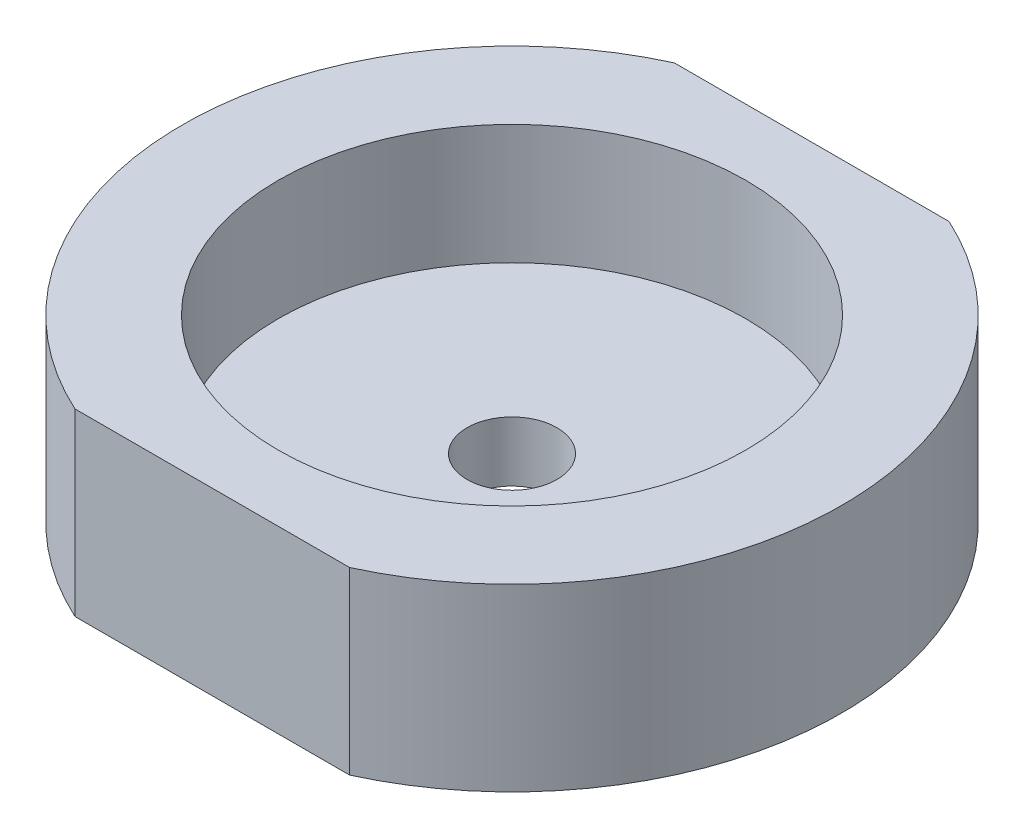
ISO-10303-21;
HEADER;
FILE_DESCRIPTION(('STEP AP214'),'2;1');
FILE_NAME('part.step','',(''),(''),'','','');
FILE_SCHEMA(('AUTOMOTIVE_DESIGN { 1 0 10303 214 1 1 1 1 }'));
ENDSEC;
DATA;
#1=APPLICATION_CONTEXT('core data for automotive mechanical design processes');
#2=APPLICATION_PROTOCOL_DEFINITION('international standard','automotive_design',2000,#1);
#3=PRODUCT_CONTEXT('',#1,'mechanical');
#4=PRODUCT('Part','Part','',(#3));
#5=PRODUCT_RELATED_PRODUCT_CATEGORY('part','',(#4));
#6=PRODUCT_DEFINITION_FORMATION('','',#4);
#7=PRODUCT_DEFINITION_CONTEXT('part definition',#1,'design');
#8=PRODUCT_DEFINITION('design','',#6,#7);
#9=PRODUCT_DEFINITION_SHAPE('','',#8);
#10=(LENGTH_UNIT() NAMED_UNIT(*) SI_UNIT(.MILLI.,.METRE.));
#11=(NAMED_UNIT(*) PLANE_ANGLE_UNIT() SI_UNIT($,.RADIAN.));
#12=(NAMED_UNIT(*) SI_UNIT($,.STERADIAN.) SOLID_ANGLE_UNIT());
#13=UNCERTAINTY_MEASURE_WITH_UNIT(LENGTH_MEASURE(1.E-05),#10,'distance_accuracy_value','');
#14=(GEOMETRIC_REPRESENTATION_CONTEXT(3) GLOBAL_UNCERTAINTY_ASSIGNED_CONTEXT((#13)) GLOBAL_UNIT_ASSIGNED_CONTEXT((#10,
#11,#12)) REPRESENTATION_CONTEXT('',''));
#15=CARTESIAN_POINT('',(0.,0.,0.));
#16=DIRECTION('',(0.,0.,1.));
#17=DIRECTION('',(1.,0.,0.));
#18=AXIS2_PLACEMENT_3D('',#15,#16,#17);
#19=CARTESIAN_POINT('',(0.,3.,-5.));
#20=DIRECTION('',(0.,0.,-1.));
#21=DIRECTION('',(-1.,0.,0.));
#22=AXIS2_PLACEMENT_3D('',#19,#20,#21);
#23=PLANE('',#22);
#24=DIRECTION('',(1.,0.,0.));
#25=VECTOR('',#24,1.);
#26=CARTESIAN_POINT('',(0.,0.,-5.));
#27=LINE('',#26,#25);
#28=CARTESIAN_POINT('',(-2.29128784747792,0.,-5.));
#29=VERTEX_POINT('',#28);
#30=CARTESIAN_POINT('',(2.29128784747792,0.,-5.));
#31=VERTEX_POINT('',#30);
#32=EDGE_CURVE('E106',#29,#31,#27,.T.);
#33=ORIENTED_EDGE('',*,*,#32,.F.);
#34=DIRECTION('',(0.,-1.,0.));
#35=VECTOR('',#34,1.);
#36=CARTESIAN_POINT('',(-2.29128784747792,3.,-5.));
#37=LINE('',#36,#35);
#38=CARTESIAN_POINT('',(-2.29128784747792,3.,-5.));
#39=VERTEX_POINT('',#38);
#40=EDGE_CURVE('E11',#39,#29,#37,.T.);
#41=ORIENTED_EDGE('',*,*,#40,.F.);
#42=DIRECTION('',(1.,0.,0.));
#43=VECTOR('',#42,1.);
#44=CARTESIAN_POINT('',(0.,3.,-5.));
#45=LINE('',#44,#43);
#46=CARTESIAN_POINT('',(2.29128784747792,3.,-5.));
#47=VERTEX_POINT('',#46);
#48=EDGE_CURVE('E90',#39,#47,#45,.T.);
#49=ORIENTED_EDGE('',*,*,#48,.T.);
#50=DIRECTION('',(0.,-1.,0.));
#51=VECTOR('',#50,1.);
#52=CARTESIAN_POINT('',(2.29128784747792,3.,-5.));
#53=LINE('',#52,#51);
#54=EDGE_CURVE('E79',#47,#31,#53,.T.);
#55=ORIENTED_EDGE('',*,*,#54,.T.);
#56=EDGE_LOOP('',(#33,#41,#49,#55));
#57=FACE_BOUND('',#56,.T.);
#58=ADVANCED_FACE('F39',(#57),#23,.T.);
#59=CARTESIAN_POINT('',(0.,3.,0.));
#60=DIRECTION('',(0.,-1.,0.));
#61=DIRECTION('',(0.,0.,-1.));
#62=AXIS2_PLACEMENT_3D('',#59,#60,#61);
#63=CYLINDRICAL_SURFACE('',#62,5.5);
#64=CARTESIAN_POINT('',(0.,0.,0.));
#65=DIRECTION('',(0.,1.,0.));
#66=DIRECTION('',(0.,0.,1.));
#67=AXIS2_PLACEMENT_3D('',#64,#65,#66);
#68=CIRCLE('',#67,5.5);
#69=CARTESIAN_POINT('',(-2.29128784747792,0.,5.));
#70=VERTEX_POINT('',#69);
#71=EDGE_CURVE('E96',#29,#70,#68,.T.);
#72=ORIENTED_EDGE('',*,*,#71,.T.);
#73=DIRECTION('',(0.,-1.,0.));
#74=VECTOR('',#73,1.);
#75=CARTESIAN_POINT('',(-2.29128784747792,3.,5.));
#76=LINE('',#75,#74);
#77=CARTESIAN_POINT('',(-2.29128784747792,3.,5.));
#78=VERTEX_POINT('',#77);
#79=EDGE_CURVE('E48',#78,#70,#76,.T.);
#80=ORIENTED_EDGE('',*,*,#79,.F.);
#81=CARTESIAN_POINT('',(0.,3.,0.));
#82=DIRECTION('',(0.,1.,0.));
#83=DIRECTION('',(0.,0.,1.));
#84=AXIS2_PLACEMENT_3D('',#81,#82,#83);
#85=CIRCLE('',#84,5.5);
#86=EDGE_CURVE('E85',#39,#78,#85,.T.);
#87=ORIENTED_EDGE('',*,*,#86,.F.);
#88=ORIENTED_EDGE('',*,*,#40,.T.);
#89=EDGE_LOOP('',(#72,#80,#87,#88));
#90=FACE_BOUND('',#89,.T.);
#91=ADVANCED_FACE('F94',(#90),#63,.T.);
#92=CARTESIAN_POINT('',(0.,3.,5.));
#93=DIRECTION('',(0.,0.,-1.));
#94=DIRECTION('',(-1.,0.,0.));
#95=AXIS2_PLACEMENT_3D('',#92,#93,#94);
#96=PLANE('',#95);
#97=DIRECTION('',(1.,0.,0.));
#98=VECTOR('',#97,1.);
#99=CARTESIAN_POINT('',(0.,0.,5.));
#100=LINE('',#99,#98);
#101=CARTESIAN_POINT('',(2.29128784747792,0.,5.));
#102=VERTEX_POINT('',#101);
#103=EDGE_CURVE('E72',#70,#102,#100,.T.);
#104=ORIENTED_EDGE('',*,*,#103,.T.);
#105=DIRECTION('',(0.,-1.,0.));
#106=VECTOR('',#105,1.);
#107=CARTESIAN_POINT('',(2.29128784747792,3.,5.));
#108=LINE('',#107,#106);
#109=CARTESIAN_POINT('',(2.29128784747792,3.,5.));
#110=VERTEX_POINT('',#109);
#111=EDGE_CURVE('E98',#110,#102,#108,.T.);
#112=ORIENTED_EDGE('',*,*,#111,.F.);
#113=DIRECTION('',(1.,0.,0.));
#114=VECTOR('',#113,1.);
#115=CARTESIAN_POINT('',(0.,3.,5.));
#116=LINE('',#115,#114);
#117=EDGE_CURVE('E89',#78,#110,#116,.T.);
#118=ORIENTED_EDGE('',*,*,#117,.F.);
#119=ORIENTED_EDGE('',*,*,#79,.T.);
#120=EDGE_LOOP('',(#104,#112,#118,#119));
#121=FACE_BOUND('',#120,.T.);
#122=ADVANCED_FACE('F99',(#121),#96,.F.);
#123=CARTESIAN_POINT('',(0.,3.,0.));
#124=DIRECTION('',(0.,-1.,0.));
#125=DIRECTION('',(0.,0.,-1.));
#126=AXIS2_PLACEMENT_3D('',#123,#124,#125);
#127=CYLINDRICAL_SURFACE('',#126,5.5);
#128=CARTESIAN_POINT('',(0.,0.,0.));
#129=DIRECTION('',(0.,1.,0.));
#130=DIRECTION('',(0.,0.,1.));
#131=AXIS2_PLACEMENT_3D('',#128,#129,#130);
#132=CIRCLE('',#131,5.5);
#133=EDGE_CURVE('E115',#102,#31,#132,.T.);
#134=ORIENTED_EDGE('',*,*,#133,.T.);
#135=ORIENTED_EDGE('',*,*,#54,.F.);
#136=CARTESIAN_POINT('',(0.,3.,0.));
#137=DIRECTION('',(0.,1.,0.));
#138=DIRECTION('',(0.,0.,1.));
#139=AXIS2_PLACEMENT_3D('',#136,#137,#138);
#140=CIRCLE('',#139,5.5);
#141=EDGE_CURVE('E56',#110,#47,#140,.T.);
#142=ORIENTED_EDGE('',*,*,#141,.F.);
#143=ORIENTED_EDGE('',*,*,#111,.T.);
#144=EDGE_LOOP('',(#134,#135,#142,#143));
#145=FACE_BOUND('',#144,.T.);
#146=ADVANCED_FACE('F123',(#145),#127,.T.);
#147=CARTESIAN_POINT('',(0.,3.,0.));
#148=DIRECTION('',(0.,1.,0.));
#149=DIRECTION('',(0.,0.,1.));
#150=AXIS2_PLACEMENT_3D('',#147,#148,#149);
#151=PLANE('',#150);
#152=CARTESIAN_POINT('',(0.,3.,0.));
#153=DIRECTION('',(0.,1.,0.));
#154=DIRECTION('',(0.,0.,1.));
#155=AXIS2_PLACEMENT_3D('',#152,#153,#154);
#156=CIRCLE('',#155,3.9);
#157=CARTESIAN_POINT('',(0.,3.,3.9));
#158=VERTEX_POINT('',#157);
#159=EDGE_CURVE('E166',#158,#158,#156,.T.);
#160=ORIENTED_EDGE('',*,*,#159,.F.);
#161=EDGE_LOOP('',(#160));
#162=FACE_BOUND('',#161,.T.);
#163=ORIENTED_EDGE('',*,*,#48,.F.);
#164=ORIENTED_EDGE('',*,*,#86,.T.);
#165=ORIENTED_EDGE('',*,*,#117,.T.);
#166=ORIENTED_EDGE('',*,*,#141,.T.);
#167=EDGE_LOOP('',(#163,#164,#165,#166));
#168=FACE_BOUND('',#167,.T.);
#169=ADVANCED_FACE('F87',(#162,#168),#151,.T.);
#170=CARTESIAN_POINT('',(0.,0.,0.));
#171=DIRECTION('',(0.,1.,0.));
#172=DIRECTION('',(0.,0.,1.));
#173=AXIS2_PLACEMENT_3D('',#170,#171,#172);
#174=PLANE('',#173);
#175=CARTESIAN_POINT('',(0.,0.,0.));
#176=DIRECTION('',(0.,-1.,0.));
#177=DIRECTION('',(0.,0.,-1.));
#178=AXIS2_PLACEMENT_3D('',#175,#176,#177);
#179=CIRCLE('',#178,0.75);
#180=CARTESIAN_POINT('',(0.,0.,-0.75));
#181=VERTEX_POINT('',#180);
#182=EDGE_CURVE('E159',#181,#181,#179,.T.);
#183=ORIENTED_EDGE('',*,*,#182,.F.);
#184=EDGE_LOOP('',(#183));
#185=FACE_BOUND('',#184,.T.);
#186=ORIENTED_EDGE('',*,*,#32,.T.);
#187=ORIENTED_EDGE('',*,*,#133,.F.);
#188=ORIENTED_EDGE('',*,*,#103,.F.);
#189=ORIENTED_EDGE('',*,*,#71,.F.);
#190=EDGE_LOOP('',(#186,#187,#188,#189));
#191=FACE_BOUND('',#190,.T.);
#192=ADVANCED_FACE('F125',(#185,#191),#174,.F.);
#193=CARTESIAN_POINT('',(0.,1.,0.));
#194=DIRECTION('',(0.,1.,0.));
#195=DIRECTION('',(0.,0.,1.));
#196=AXIS2_PLACEMENT_3D('',#193,#194,#195);
#197=CYLINDRICAL_SURFACE('',#196,3.9);
#198=CARTESIAN_POINT('',(0.,1.,0.));
#199=DIRECTION('',(0.,1.,0.));
#200=DIRECTION('',(0.,0.,1.));
#201=AXIS2_PLACEMENT_3D('',#198,#199,#200);
#202=CIRCLE('',#201,3.9);
#203=CARTESIAN_POINT('',(0.,1.,3.9));
#204=VERTEX_POINT('',#203);
#205=EDGE_CURVE('E110',#204,#204,#202,.T.);
#206=ORIENTED_EDGE('',*,*,#205,.F.);
#207=EDGE_LOOP('',(#206));
#208=FACE_BOUND('',#207,.T.);
#209=ORIENTED_EDGE('',*,*,#159,.T.);
#210=EDGE_LOOP('',(#209));
#211=FACE_BOUND('',#210,.T.);
#212=ADVANCED_FACE('F139',(#208,#211),#197,.F.);
#213=CARTESIAN_POINT('',(0.,1.,0.));
#214=DIRECTION('',(0.,1.,0.));
#215=DIRECTION('',(0.,0.,1.));
#216=AXIS2_PLACEMENT_3D('',#213,#214,#215);
#217=PLANE('',#216);
#218=CARTESIAN_POINT('',(0.,1.,0.));
#219=DIRECTION('',(0.,-1.,0.));
#220=DIRECTION('',(0.,0.,-1.));
#221=AXIS2_PLACEMENT_3D('',#218,#219,#220);
#222=CIRCLE('',#221,0.75);
#223=CARTESIAN_POINT('',(0.,1.,-0.75));
#224=VERTEX_POINT('',#223);
#225=EDGE_CURVE('E162',#224,#224,#222,.T.);
#226=ORIENTED_EDGE('',*,*,#225,.T.);
#227=EDGE_LOOP('',(#226));
#228=FACE_BOUND('',#227,.T.);
#229=ORIENTED_EDGE('',*,*,#205,.T.);
#230=EDGE_LOOP('',(#229));
#231=FACE_BOUND('',#230,.T.);
#232=ADVANCED_FACE('F146',(#228,#231),#217,.T.);
#233=CARTESIAN_POINT('',(0.,0.,0.));
#234=DIRECTION('',(0.,1.,0.));
#235=DIRECTION('',(0.,0.,1.));
#236=AXIS2_PLACEMENT_3D('',#233,#234,#235);
#237=CYLINDRICAL_SURFACE('',#236,0.75);
#238=ORIENTED_EDGE('',*,*,#182,.T.);
#239=EDGE_LOOP('',(#238));
#240=FACE_BOUND('',#239,.T.);
#241=ORIENTED_EDGE('',*,*,#225,.F.);
#242=EDGE_LOOP('',(#241));
#243=FACE_BOUND('',#242,.T.);
#244=ADVANCED_FACE('F150',(#240,#243),#237,.F.);
#245=CLOSED_SHELL('',(#58,#91,#122,#146,#169,#192,#212,#232,#244));
#246=MANIFOLD_SOLID_BREP('B2',#245);
#247=ADVANCED_BREP_SHAPE_REPRESENTATION('',(#18,#246),#14);
#248=SHAPE_DEFINITION_REPRESENTATION(#9,#247);
ENDSEC;
END-ISO-10303-21;
